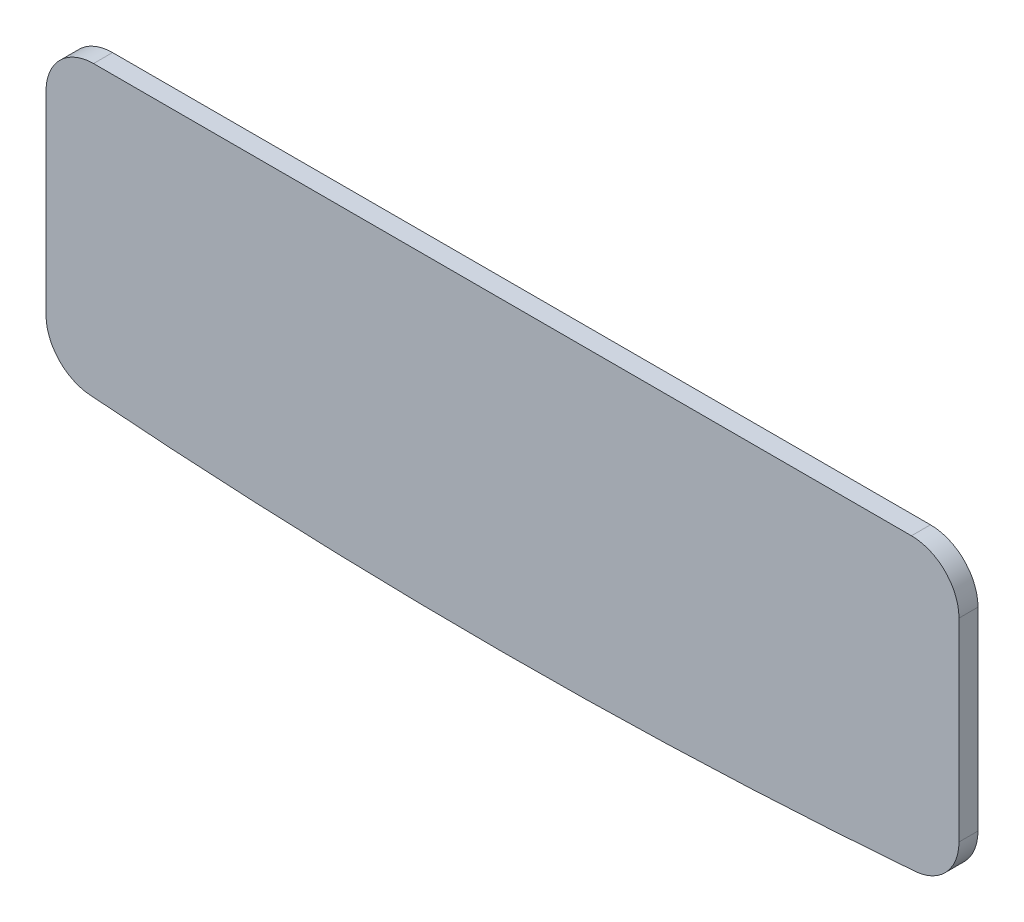
ISO-10303-21;
HEADER;
FILE_DESCRIPTION(('STEP AP214'),'2;1');
FILE_NAME('part.step','',(''),(''),'','','');
FILE_SCHEMA(('AUTOMOTIVE_DESIGN { 1 0 10303 214 1 1 1 1 }'));
ENDSEC;
DATA;
#1=APPLICATION_CONTEXT('core data for automotive mechanical design processes');
#2=APPLICATION_PROTOCOL_DEFINITION('international standard','automotive_design',2000,#1);
#3=PRODUCT_CONTEXT('',#1,'mechanical');
#4=PRODUCT('Part','Part','',(#3));
#5=PRODUCT_RELATED_PRODUCT_CATEGORY('part','',(#4));
#6=PRODUCT_DEFINITION_FORMATION('','',#4);
#7=PRODUCT_DEFINITION_CONTEXT('part definition',#1,'design');
#8=PRODUCT_DEFINITION('design','',#6,#7);
#9=PRODUCT_DEFINITION_SHAPE('','',#8);
#10=(LENGTH_UNIT() NAMED_UNIT(*) SI_UNIT(.MILLI.,.METRE.));
#11=(NAMED_UNIT(*) PLANE_ANGLE_UNIT() SI_UNIT($,.RADIAN.));
#12=(NAMED_UNIT(*) SI_UNIT($,.STERADIAN.) SOLID_ANGLE_UNIT());
#13=UNCERTAINTY_MEASURE_WITH_UNIT(LENGTH_MEASURE(1.E-05),#10,'distance_accuracy_value','');
#14=(GEOMETRIC_REPRESENTATION_CONTEXT(3) GLOBAL_UNCERTAINTY_ASSIGNED_CONTEXT((#13)) GLOBAL_UNIT_ASSIGNED_CONTEXT((#10,
#11,#12)) REPRESENTATION_CONTEXT('',''));
#15=CARTESIAN_POINT('',(0.,0.,0.));
#16=DIRECTION('',(0.,0.,1.));
#17=DIRECTION('',(1.,0.,0.));
#18=AXIS2_PLACEMENT_3D('',#15,#16,#17);
#19=CARTESIAN_POINT('',(0.,0.,-2.));
#20=DIRECTION('',(0.,0.,1.));
#21=DIRECTION('',(1.,0.,0.));
#22=AXIS2_PLACEMENT_3D('',#19,#20,#21);
#23=CYLINDRICAL_SURFACE('',#22,551.);
#24=CARTESIAN_POINT('',(0.,0.,0.));
#25=DIRECTION('',(0.,0.,1.));
#26=DIRECTION('',(1.,0.,0.));
#27=AXIS2_PLACEMENT_3D('',#24,#25,#26);
#28=CIRCLE('',#27,551.);
#29=CARTESIAN_POINT('',(-43.4167960694721,-549.286793778134,0.));
#30=VERTEX_POINT('',#29);
#31=CARTESIAN_POINT('',(43.4167960694723,-549.286793778134,0.));
#32=VERTEX_POINT('',#31);
#33=EDGE_CURVE('E161',#30,#32,#28,.T.);
#34=ORIENTED_EDGE('',*,*,#33,.F.);
#35=DIRECTION('',(0.,0.,1.));
#36=VECTOR('',#35,1.);
#37=CARTESIAN_POINT('',(-43.4167960694721,-549.286793778134,-2.));
#38=LINE('',#37,#36);
#39=CARTESIAN_POINT('',(-43.4167960694721,-549.286793778134,-2.));
#40=VERTEX_POINT('',#39);
#41=EDGE_CURVE('E151',#30,#40,#38,.F.);
#42=ORIENTED_EDGE('',*,*,#41,.T.);
#43=CARTESIAN_POINT('',(0.,0.,-2.));
#44=DIRECTION('',(0.,0.,1.));
#45=DIRECTION('',(1.,0.,0.));
#46=AXIS2_PLACEMENT_3D('',#43,#44,#45);
#47=CIRCLE('',#46,551.);
#48=CARTESIAN_POINT('',(43.4167960694723,-549.286793778134,-2.));
#49=VERTEX_POINT('',#48);
#50=EDGE_CURVE('E155',#40,#49,#47,.T.);
#51=ORIENTED_EDGE('',*,*,#50,.T.);
#52=DIRECTION('',(0.,0.,1.));
#53=VECTOR('',#52,1.);
#54=CARTESIAN_POINT('',(43.4167960694723,-549.286793778134,-2.));
#55=LINE('',#54,#53);
#56=EDGE_CURVE('E148',#49,#32,#55,.T.);
#57=ORIENTED_EDGE('',*,*,#56,.T.);
#58=EDGE_LOOP('',(#34,#42,#51,#57));
#59=FACE_BOUND('',#58,.T.);
#60=ADVANCED_FACE('F38',(#59),#23,.T.);
#61=CARTESIAN_POINT('',(-48.0228142539597,-548.903278648552,-2.));
#62=DIRECTION('',(-1.,0.,0.));
#63=DIRECTION('',(0.,0.,1.));
#64=AXIS2_PLACEMENT_3D('',#61,#62,#63);
#65=PLANE('',#64);
#66=DIRECTION('',(0.,-1.,0.));
#67=VECTOR('',#66,1.);
#68=CARTESIAN_POINT('',(-48.0228142539597,-548.903278648552,0.));
#69=LINE('',#68,#67);
#70=CARTESIAN_POINT('',(-48.0228142539597,-523.903278648552,0.));
#71=VERTEX_POINT('',#70);
#72=CARTESIAN_POINT('',(-48.0228142539597,-544.302340114085,0.));
#73=VERTEX_POINT('',#72);
#74=EDGE_CURVE('E121',#71,#73,#69,.T.);
#75=ORIENTED_EDGE('',*,*,#74,.F.);
#76=DIRECTION('',(0.,0.,1.));
#77=VECTOR('',#76,1.);
#78=CARTESIAN_POINT('',(-48.0228142539597,-523.903278648552,-2.));
#79=LINE('',#78,#77);
#80=CARTESIAN_POINT('',(-48.0228142539597,-523.903278648552,-2.));
#81=VERTEX_POINT('',#80);
#82=EDGE_CURVE('E139',#71,#81,#79,.F.);
#83=ORIENTED_EDGE('',*,*,#82,.T.);
#84=DIRECTION('',(0.,-1.,0.));
#85=VECTOR('',#84,1.);
#86=CARTESIAN_POINT('',(-48.0228142539597,-548.903278648552,-2.));
#87=LINE('',#86,#85);
#88=CARTESIAN_POINT('',(-48.0228142539597,-544.302340114085,-2.));
#89=VERTEX_POINT('',#88);
#90=EDGE_CURVE('E123',#81,#89,#87,.T.);
#91=ORIENTED_EDGE('',*,*,#90,.T.);
#92=DIRECTION('',(0.,0.,1.));
#93=VECTOR('',#92,1.);
#94=CARTESIAN_POINT('',(-48.0228142539597,-544.302340114085,-2.));
#95=LINE('',#94,#93);
#96=EDGE_CURVE('E136',#89,#73,#95,.T.);
#97=ORIENTED_EDGE('',*,*,#96,.T.);
#98=EDGE_LOOP('',(#75,#83,#91,#97));
#99=FACE_BOUND('',#98,.T.);
#100=ADVANCED_FACE('F179',(#99),#65,.T.);
#101=CARTESIAN_POINT('',(-48.0228142539597,-518.903278648552,-2.));
#102=DIRECTION('',(0.,1.,0.));
#103=DIRECTION('',(0.,0.,1.));
#104=AXIS2_PLACEMENT_3D('',#101,#102,#103);
#105=PLANE('',#104);
#106=DIRECTION('',(-1.,0.,0.));
#107=VECTOR('',#106,1.);
#108=CARTESIAN_POINT('',(-48.0228142539597,-518.903278648552,-2.));
#109=LINE('',#108,#107);
#110=CARTESIAN_POINT('',(43.0228142539598,-518.903278648552,-2.));
#111=VERTEX_POINT('',#110);
#112=CARTESIAN_POINT('',(-43.0228142539597,-518.903278648552,-2.));
#113=VERTEX_POINT('',#112);
#114=EDGE_CURVE('E127',#111,#113,#109,.T.);
#115=ORIENTED_EDGE('',*,*,#114,.T.);
#116=DIRECTION('',(0.,0.,1.));
#117=VECTOR('',#116,1.);
#118=CARTESIAN_POINT('',(-43.0228142539597,-518.903278648552,-2.));
#119=LINE('',#118,#117);
#120=CARTESIAN_POINT('',(-43.0228142539597,-518.903278648552,0.));
#121=VERTEX_POINT('',#120);
#122=EDGE_CURVE('E113',#113,#121,#119,.T.);
#123=ORIENTED_EDGE('',*,*,#122,.T.);
#124=DIRECTION('',(-1.,0.,0.));
#125=VECTOR('',#124,1.);
#126=CARTESIAN_POINT('',(-48.0228142539597,-518.903278648552,0.));
#127=LINE('',#126,#125);
#128=CARTESIAN_POINT('',(43.0228142539598,-518.903278648552,0.));
#129=VERTEX_POINT('',#128);
#130=EDGE_CURVE('E106',#129,#121,#127,.T.);
#131=ORIENTED_EDGE('',*,*,#130,.F.);
#132=DIRECTION('',(0.,0.,1.));
#133=VECTOR('',#132,1.);
#134=CARTESIAN_POINT('',(43.0228142539598,-518.903278648552,-2.));
#135=LINE('',#134,#133);
#136=EDGE_CURVE('E119',#129,#111,#135,.F.);
#137=ORIENTED_EDGE('',*,*,#136,.T.);
#138=EDGE_LOOP('',(#115,#123,#131,#137));
#139=FACE_BOUND('',#138,.T.);
#140=ADVANCED_FACE('F118',(#139),#105,.T.);
#141=CARTESIAN_POINT('',(48.0228142539598,-518.903278648552,-2.));
#142=DIRECTION('',(1.,0.,0.));
#143=DIRECTION('',(0.,1.,0.));
#144=AXIS2_PLACEMENT_3D('',#141,#142,#143);
#145=PLANE('',#144);
#146=DIRECTION('',(0.,1.,0.));
#147=VECTOR('',#146,1.);
#148=CARTESIAN_POINT('',(48.0228142539598,-518.903278648552,0.));
#149=LINE('',#148,#147);
#150=CARTESIAN_POINT('',(48.0228142539598,-544.302340114085,0.));
#151=VERTEX_POINT('',#150);
#152=CARTESIAN_POINT('',(48.0228142539598,-523.903278648552,0.));
#153=VERTEX_POINT('',#152);
#154=EDGE_CURVE('E107',#151,#153,#149,.T.);
#155=ORIENTED_EDGE('',*,*,#154,.F.);
#156=DIRECTION('',(0.,0.,1.));
#157=VECTOR('',#156,1.);
#158=CARTESIAN_POINT('',(48.0228142539598,-544.302340114085,-2.));
#159=LINE('',#158,#157);
#160=CARTESIAN_POINT('',(48.0228142539598,-544.302340114085,-2.));
#161=VERTEX_POINT('',#160);
#162=EDGE_CURVE('E11',#151,#161,#159,.F.);
#163=ORIENTED_EDGE('',*,*,#162,.T.);
#164=DIRECTION('',(0.,1.,0.));
#165=VECTOR('',#164,1.);
#166=CARTESIAN_POINT('',(48.0228142539598,-518.903278648552,-2.));
#167=LINE('',#166,#165);
#168=CARTESIAN_POINT('',(48.0228142539598,-523.903278648552,-2.));
#169=VERTEX_POINT('',#168);
#170=EDGE_CURVE('E153',#161,#169,#167,.T.);
#171=ORIENTED_EDGE('',*,*,#170,.T.);
#172=DIRECTION('',(0.,0.,1.));
#173=VECTOR('',#172,1.);
#174=CARTESIAN_POINT('',(48.0228142539598,-523.903278648552,-2.));
#175=LINE('',#174,#173);
#176=EDGE_CURVE('E46',#169,#153,#175,.T.);
#177=ORIENTED_EDGE('',*,*,#176,.T.);
#178=EDGE_LOOP('',(#155,#163,#171,#177));
#179=FACE_BOUND('',#178,.T.);
#180=ADVANCED_FACE('F152',(#179),#145,.T.);
#181=CARTESIAN_POINT('',(0.,0.,-2.));
#182=DIRECTION('',(0.,0.,1.));
#183=DIRECTION('',(1.,0.,0.));
#184=AXIS2_PLACEMENT_3D('',#181,#182,#183);
#185=PLANE('',#184);
#186=ORIENTED_EDGE('',*,*,#90,.F.);
#187=CARTESIAN_POINT('',(-43.0228142539597,-523.903278648552,-2.));
#188=DIRECTION('',(0.,0.,1.));
#189=DIRECTION('',(1.,0.,0.));
#190=AXIS2_PLACEMENT_3D('',#187,#188,#189);
#191=CIRCLE('',#190,5.);
#192=EDGE_CURVE('E146',#81,#113,#191,.F.);
#193=ORIENTED_EDGE('',*,*,#192,.T.);
#194=ORIENTED_EDGE('',*,*,#114,.F.);
#195=CARTESIAN_POINT('',(43.0228142539598,-523.903278648552,-2.));
#196=DIRECTION('',(0.,0.,1.));
#197=DIRECTION('',(1.,0.,0.));
#198=AXIS2_PLACEMENT_3D('',#195,#196,#197);
#199=CIRCLE('',#198,5.);
#200=EDGE_CURVE('E53',#111,#169,#199,.F.);
#201=ORIENTED_EDGE('',*,*,#200,.T.);
#202=ORIENTED_EDGE('',*,*,#170,.F.);
#203=CARTESIAN_POINT('',(43.0228142539598,-544.302340114085,-2.));
#204=DIRECTION('',(0.,0.,1.));
#205=DIRECTION('',(1.,0.,0.));
#206=AXIS2_PLACEMENT_3D('',#203,#204,#205);
#207=CIRCLE('',#206,5.);
#208=EDGE_CURVE('E142',#161,#49,#207,.F.);
#209=ORIENTED_EDGE('',*,*,#208,.T.);
#210=ORIENTED_EDGE('',*,*,#50,.F.);
#211=CARTESIAN_POINT('',(-43.0228142539597,-544.302340114085,-2.));
#212=DIRECTION('',(0.,0.,1.));
#213=DIRECTION('',(1.,0.,0.));
#214=AXIS2_PLACEMENT_3D('',#211,#212,#213);
#215=CIRCLE('',#214,5.);
#216=EDGE_CURVE('E144',#40,#89,#215,.F.);
#217=ORIENTED_EDGE('',*,*,#216,.T.);
#218=EDGE_LOOP('',(#186,#193,#194,#201,#202,#209,#210,#217));
#219=FACE_BOUND('',#218,.T.);
#220=ADVANCED_FACE('F175',(#219),#185,.F.);
#221=CARTESIAN_POINT('',(0.,0.,0.));
#222=DIRECTION('',(0.,0.,1.));
#223=DIRECTION('',(1.,0.,0.));
#224=AXIS2_PLACEMENT_3D('',#221,#222,#223);
#225=PLANE('',#224);
#226=ORIENTED_EDGE('',*,*,#130,.T.);
#227=CARTESIAN_POINT('',(-43.0228142539597,-523.903278648552,0.));
#228=DIRECTION('',(0.,0.,1.));
#229=DIRECTION('',(1.,0.,0.));
#230=AXIS2_PLACEMENT_3D('',#227,#228,#229);
#231=CIRCLE('',#230,5.);
#232=EDGE_CURVE('E134',#121,#71,#231,.T.);
#233=ORIENTED_EDGE('',*,*,#232,.T.);
#234=ORIENTED_EDGE('',*,*,#74,.T.);
#235=CARTESIAN_POINT('',(-43.0228142539597,-544.302340114085,0.));
#236=DIRECTION('',(0.,0.,1.));
#237=DIRECTION('',(1.,0.,0.));
#238=AXIS2_PLACEMENT_3D('',#235,#236,#237);
#239=CIRCLE('',#238,5.);
#240=EDGE_CURVE('E132',#73,#30,#239,.T.);
#241=ORIENTED_EDGE('',*,*,#240,.T.);
#242=ORIENTED_EDGE('',*,*,#33,.T.);
#243=CARTESIAN_POINT('',(43.0228142539598,-544.302340114085,0.));
#244=DIRECTION('',(0.,0.,1.));
#245=DIRECTION('',(1.,0.,0.));
#246=AXIS2_PLACEMENT_3D('',#243,#244,#245);
#247=CIRCLE('',#246,5.);
#248=EDGE_CURVE('E112',#32,#151,#247,.T.);
#249=ORIENTED_EDGE('',*,*,#248,.T.);
#250=ORIENTED_EDGE('',*,*,#154,.T.);
#251=CARTESIAN_POINT('',(43.0228142539598,-523.903278648552,0.));
#252=DIRECTION('',(0.,0.,1.));
#253=DIRECTION('',(1.,0.,0.));
#254=AXIS2_PLACEMENT_3D('',#251,#252,#253);
#255=CIRCLE('',#254,5.);
#256=EDGE_CURVE('E103',#153,#129,#255,.T.);
#257=ORIENTED_EDGE('',*,*,#256,.T.);
#258=EDGE_LOOP('',(#226,#233,#234,#241,#242,#249,#250,#257));
#259=FACE_BOUND('',#258,.T.);
#260=ADVANCED_FACE('F105',(#259),#225,.T.);
#261=CARTESIAN_POINT('',(-43.0228142539597,-523.903278648552,-2.));
#262=DIRECTION('',(0.,0.,1.));
#263=DIRECTION('',(1.,0.,0.));
#264=AXIS2_PLACEMENT_3D('',#261,#262,#263);
#265=CYLINDRICAL_SURFACE('',#264,5.);
#266=ORIENTED_EDGE('',*,*,#192,.F.);
#267=ORIENTED_EDGE('',*,*,#82,.F.);
#268=ORIENTED_EDGE('',*,*,#232,.F.);
#269=ORIENTED_EDGE('',*,*,#122,.F.);
#270=EDGE_LOOP('',(#266,#267,#268,#269));
#271=FACE_BOUND('',#270,.T.);
#272=ADVANCED_FACE('F182',(#271),#265,.T.);
#273=CARTESIAN_POINT('',(-43.0228142539597,-544.302340114085,-2.));
#274=DIRECTION('',(0.,0.,1.));
#275=DIRECTION('',(1.,0.,0.));
#276=AXIS2_PLACEMENT_3D('',#273,#274,#275);
#277=CYLINDRICAL_SURFACE('',#276,5.);
#278=ORIENTED_EDGE('',*,*,#216,.F.);
#279=ORIENTED_EDGE('',*,*,#41,.F.);
#280=ORIENTED_EDGE('',*,*,#240,.F.);
#281=ORIENTED_EDGE('',*,*,#96,.F.);
#282=EDGE_LOOP('',(#278,#279,#280,#281));
#283=FACE_BOUND('',#282,.T.);
#284=ADVANCED_FACE('F172',(#283),#277,.T.);
#285=CARTESIAN_POINT('',(43.0228142539598,-544.302340114085,-2.));
#286=DIRECTION('',(0.,0.,1.));
#287=DIRECTION('',(1.,0.,0.));
#288=AXIS2_PLACEMENT_3D('',#285,#286,#287);
#289=CYLINDRICAL_SURFACE('',#288,5.);
#290=ORIENTED_EDGE('',*,*,#208,.F.);
#291=ORIENTED_EDGE('',*,*,#162,.F.);
#292=ORIENTED_EDGE('',*,*,#248,.F.);
#293=ORIENTED_EDGE('',*,*,#56,.F.);
#294=EDGE_LOOP('',(#290,#291,#292,#293));
#295=FACE_BOUND('',#294,.T.);
#296=ADVANCED_FACE('F189',(#295),#289,.T.);
#297=CARTESIAN_POINT('',(43.0228142539598,-523.903278648552,-2.));
#298=DIRECTION('',(0.,0.,1.));
#299=DIRECTION('',(1.,0.,0.));
#300=AXIS2_PLACEMENT_3D('',#297,#298,#299);
#301=CYLINDRICAL_SURFACE('',#300,5.);
#302=ORIENTED_EDGE('',*,*,#200,.F.);
#303=ORIENTED_EDGE('',*,*,#136,.F.);
#304=ORIENTED_EDGE('',*,*,#256,.F.);
#305=ORIENTED_EDGE('',*,*,#176,.F.);
#306=EDGE_LOOP('',(#302,#303,#304,#305));
#307=FACE_BOUND('',#306,.T.);
#308=ADVANCED_FACE('F40',(#307),#301,.T.);
#309=CLOSED_SHELL('',(#60,#100,#140,#180,#220,#260,#272,#284,#296,#308));
#310=MANIFOLD_SOLID_BREP('B2',#309);
#311=ADVANCED_BREP_SHAPE_REPRESENTATION('',(#18,#310),#14);
#312=SHAPE_DEFINITION_REPRESENTATION(#9,#311);
ENDSEC;
END-ISO-10303-21;
